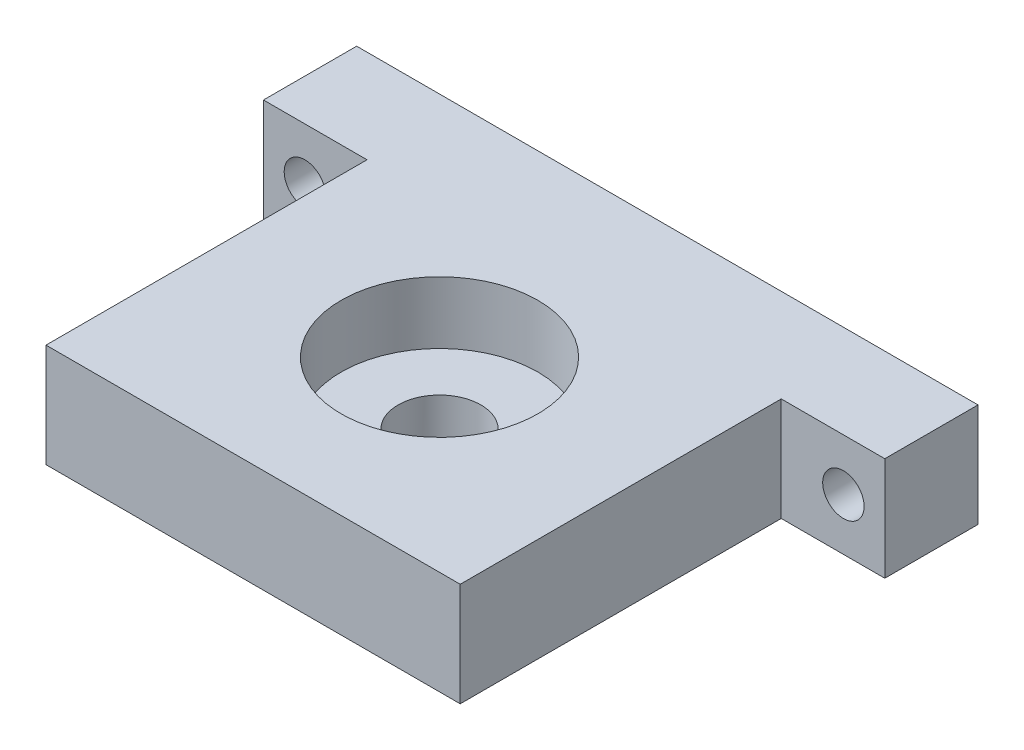
ISO-10303-21;
HEADER;
FILE_DESCRIPTION(('STEP AP214'),'2;1');
FILE_NAME('part.step','',(''),(''),'','','');
FILE_SCHEMA(('AUTOMOTIVE_DESIGN { 1 0 10303 214 1 1 1 1 }'));
ENDSEC;
DATA;
#1=APPLICATION_CONTEXT('core data for automotive mechanical design processes');
#2=APPLICATION_PROTOCOL_DEFINITION('international standard','automotive_design',2000,#1);
#3=PRODUCT_CONTEXT('',#1,'mechanical');
#4=PRODUCT('Part','Part','',(#3));
#5=PRODUCT_RELATED_PRODUCT_CATEGORY('part','',(#4));
#6=PRODUCT_DEFINITION_FORMATION('','',#4);
#7=PRODUCT_DEFINITION_CONTEXT('part definition',#1,'design');
#8=PRODUCT_DEFINITION('design','',#6,#7);
#9=PRODUCT_DEFINITION_SHAPE('','',#8);
#10=(LENGTH_UNIT() NAMED_UNIT(*) SI_UNIT(.MILLI.,.METRE.));
#11=(NAMED_UNIT(*) PLANE_ANGLE_UNIT() SI_UNIT($,.RADIAN.));
#12=(NAMED_UNIT(*) SI_UNIT($,.STERADIAN.) SOLID_ANGLE_UNIT());
#13=UNCERTAINTY_MEASURE_WITH_UNIT(LENGTH_MEASURE(1.E-05),#10,'distance_accuracy_value','');
#14=(GEOMETRIC_REPRESENTATION_CONTEXT(3) GLOBAL_UNCERTAINTY_ASSIGNED_CONTEXT((#13)) GLOBAL_UNIT_ASSIGNED_CONTEXT((#10,
#11,#12)) REPRESENTATION_CONTEXT('',''));
#15=CARTESIAN_POINT('',(0.,0.,0.));
#16=DIRECTION('',(0.,0.,1.));
#17=DIRECTION('',(1.,0.,0.));
#18=AXIS2_PLACEMENT_3D('',#15,#16,#17);
#19=CARTESIAN_POINT('',(-20.,10.,-20.));
#20=DIRECTION('',(0.,0.,1.));
#21=DIRECTION('',(1.,0.,0.));
#22=AXIS2_PLACEMENT_3D('',#19,#20,#21);
#23=PLANE('',#22);
#24=CARTESIAN_POINT('',(26.,5.,-20.));
#25=DIRECTION('',(0.,0.,1.));
#26=DIRECTION('',(1.,0.,0.));
#27=AXIS2_PLACEMENT_3D('',#24,#25,#26);
#28=CIRCLE('',#27,2.);
#29=CARTESIAN_POINT('',(28.,5.,-20.));
#30=VERTEX_POINT('',#29);
#31=EDGE_CURVE('E167',#30,#30,#28,.T.);
#32=ORIENTED_EDGE('',*,*,#31,.T.);
#33=EDGE_LOOP('',(#32));
#34=FACE_BOUND('',#33,.T.);
#35=CARTESIAN_POINT('',(-26.,5.,-20.));
#36=DIRECTION('',(0.,0.,1.));
#37=DIRECTION('',(1.,0.,0.));
#38=AXIS2_PLACEMENT_3D('',#35,#36,#37);
#39=CIRCLE('',#38,2.);
#40=CARTESIAN_POINT('',(-24.,5.,-20.));
#41=VERTEX_POINT('',#40);
#42=EDGE_CURVE('E175',#41,#41,#39,.T.);
#43=ORIENTED_EDGE('',*,*,#42,.T.);
#44=EDGE_LOOP('',(#43));
#45=FACE_BOUND('',#44,.T.);
#46=DIRECTION('',(-1.,0.,0.));
#47=VECTOR('',#46,1.);
#48=CARTESIAN_POINT('',(-20.,0.,-20.));
#49=LINE('',#48,#47);
#50=CARTESIAN_POINT('',(30.,0.,-20.));
#51=VERTEX_POINT('',#50);
#52=CARTESIAN_POINT('',(-30.,0.,-20.));
#53=VERTEX_POINT('',#52);
#54=EDGE_CURVE('E89',#51,#53,#49,.T.);
#55=ORIENTED_EDGE('',*,*,#54,.T.);
#56=DIRECTION('',(0.,-1.,0.));
#57=VECTOR('',#56,1.);
#58=CARTESIAN_POINT('',(-30.,10.,-20.));
#59=LINE('',#58,#57);
#60=CARTESIAN_POINT('',(-30.,10.,-20.));
#61=VERTEX_POINT('',#60);
#62=EDGE_CURVE('E11',#61,#53,#59,.T.);
#63=ORIENTED_EDGE('',*,*,#62,.F.);
#64=DIRECTION('',(-1.,0.,0.));
#65=VECTOR('',#64,1.);
#66=CARTESIAN_POINT('',(20.,10.,-20.));
#67=LINE('',#66,#65);
#68=CARTESIAN_POINT('',(30.,10.,-20.));
#69=VERTEX_POINT('',#68);
#70=EDGE_CURVE('E95',#69,#61,#67,.T.);
#71=ORIENTED_EDGE('',*,*,#70,.F.);
#72=DIRECTION('',(0.,-1.,0.));
#73=VECTOR('',#72,1.);
#74=CARTESIAN_POINT('',(30.,10.,-20.));
#75=LINE('',#74,#73);
#76=EDGE_CURVE('E129',#69,#51,#75,.T.);
#77=ORIENTED_EDGE('',*,*,#76,.T.);
#78=EDGE_LOOP('',(#55,#63,#71,#77));
#79=FACE_BOUND('',#78,.T.);
#80=ADVANCED_FACE('F35',(#34,#45,#79),#23,.F.);
#81=CARTESIAN_POINT('',(-30.,10.,-20.));
#82=DIRECTION('',(1.,0.,0.));
#83=DIRECTION('',(0.,0.,-1.));
#84=AXIS2_PLACEMENT_3D('',#81,#82,#83);
#85=PLANE('',#84);
#86=DIRECTION('',(0.,0.,1.));
#87=VECTOR('',#86,1.);
#88=CARTESIAN_POINT('',(-30.,0.,-20.));
#89=LINE('',#88,#87);
#90=CARTESIAN_POINT('',(-30.,0.,-11.));
#91=VERTEX_POINT('',#90);
#92=EDGE_CURVE('E134',#53,#91,#89,.T.);
#93=ORIENTED_EDGE('',*,*,#92,.T.);
#94=DIRECTION('',(0.,-1.,0.));
#95=VECTOR('',#94,1.);
#96=CARTESIAN_POINT('',(-30.,10.,-11.));
#97=LINE('',#96,#95);
#98=CARTESIAN_POINT('',(-30.,10.,-11.));
#99=VERTEX_POINT('',#98);
#100=EDGE_CURVE('E44',#99,#91,#97,.T.);
#101=ORIENTED_EDGE('',*,*,#100,.F.);
#102=DIRECTION('',(0.,0.,1.));
#103=VECTOR('',#102,1.);
#104=CARTESIAN_POINT('',(-30.,10.,-20.));
#105=LINE('',#104,#103);
#106=EDGE_CURVE('E184',#61,#99,#105,.T.);
#107=ORIENTED_EDGE('',*,*,#106,.F.);
#108=ORIENTED_EDGE('',*,*,#62,.T.);
#109=EDGE_LOOP('',(#93,#101,#107,#108));
#110=FACE_BOUND('',#109,.T.);
#111=ADVANCED_FACE('F206',(#110),#85,.F.);
#112=CARTESIAN_POINT('',(-20.,10.,-11.));
#113=DIRECTION('',(0.,0.,-1.));
#114=DIRECTION('',(-1.,0.,0.));
#115=AXIS2_PLACEMENT_3D('',#112,#113,#114);
#116=PLANE('',#115);
#117=CARTESIAN_POINT('',(-26.,5.,-11.));
#118=DIRECTION('',(0.,0.,-1.));
#119=DIRECTION('',(-1.,0.,0.));
#120=AXIS2_PLACEMENT_3D('',#117,#118,#119);
#121=CIRCLE('',#120,2.);
#122=CARTESIAN_POINT('',(-28.,5.,-11.));
#123=VERTEX_POINT('',#122);
#124=EDGE_CURVE('E38',#123,#123,#121,.T.);
#125=ORIENTED_EDGE('',*,*,#124,.T.);
#126=EDGE_LOOP('',(#125));
#127=FACE_BOUND('',#126,.T.);
#128=DIRECTION('',(1.,0.,0.));
#129=VECTOR('',#128,1.);
#130=CARTESIAN_POINT('',(-20.,0.,-11.));
#131=LINE('',#130,#129);
#132=CARTESIAN_POINT('',(-20.,0.,-11.));
#133=VERTEX_POINT('',#132);
#134=EDGE_CURVE('E137',#91,#133,#131,.T.);
#135=ORIENTED_EDGE('',*,*,#134,.T.);
#136=DIRECTION('',(0.,-1.,0.));
#137=VECTOR('',#136,1.);
#138=CARTESIAN_POINT('',(-20.,10.,-11.));
#139=LINE('',#138,#137);
#140=CARTESIAN_POINT('',(-20.,10.,-11.));
#141=VERTEX_POINT('',#140);
#142=EDGE_CURVE('E154',#141,#133,#139,.T.);
#143=ORIENTED_EDGE('',*,*,#142,.F.);
#144=DIRECTION('',(1.,0.,0.));
#145=VECTOR('',#144,1.);
#146=CARTESIAN_POINT('',(-20.,10.,-11.));
#147=LINE('',#146,#145);
#148=EDGE_CURVE('E186',#99,#141,#147,.T.);
#149=ORIENTED_EDGE('',*,*,#148,.F.);
#150=ORIENTED_EDGE('',*,*,#100,.T.);
#151=EDGE_LOOP('',(#135,#143,#149,#150));
#152=FACE_BOUND('',#151,.T.);
#153=ADVANCED_FACE('F209',(#127,#152),#116,.F.);
#154=CARTESIAN_POINT('',(-20.,10.,20.));
#155=DIRECTION('',(1.,0.,0.));
#156=DIRECTION('',(0.,0.,-1.));
#157=AXIS2_PLACEMENT_3D('',#154,#155,#156);
#158=PLANE('',#157);
#159=DIRECTION('',(0.,0.,1.));
#160=VECTOR('',#159,1.);
#161=CARTESIAN_POINT('',(-20.,0.,20.));
#162=LINE('',#161,#160);
#163=CARTESIAN_POINT('',(-20.,0.,20.));
#164=VERTEX_POINT('',#163);
#165=EDGE_CURVE('E139',#133,#164,#162,.T.);
#166=ORIENTED_EDGE('',*,*,#165,.T.);
#167=DIRECTION('',(0.,-1.,0.));
#168=VECTOR('',#167,1.);
#169=CARTESIAN_POINT('',(-20.,10.,20.));
#170=LINE('',#169,#168);
#171=CARTESIAN_POINT('',(-20.,10.,20.));
#172=VERTEX_POINT('',#171);
#173=EDGE_CURVE('E151',#172,#164,#170,.T.);
#174=ORIENTED_EDGE('',*,*,#173,.F.);
#175=DIRECTION('',(0.,0.,1.));
#176=VECTOR('',#175,1.);
#177=CARTESIAN_POINT('',(-20.,10.,20.));
#178=LINE('',#177,#176);
#179=EDGE_CURVE('E188',#141,#172,#178,.T.);
#180=ORIENTED_EDGE('',*,*,#179,.F.);
#181=ORIENTED_EDGE('',*,*,#142,.T.);
#182=EDGE_LOOP('',(#166,#174,#180,#181));
#183=FACE_BOUND('',#182,.T.);
#184=ADVANCED_FACE('F194',(#183),#158,.F.);
#185=CARTESIAN_POINT('',(-20.,10.,20.));
#186=DIRECTION('',(0.,0.,-1.));
#187=DIRECTION('',(-1.,0.,0.));
#188=AXIS2_PLACEMENT_3D('',#185,#186,#187);
#189=PLANE('',#188);
#190=DIRECTION('',(1.,0.,0.));
#191=VECTOR('',#190,1.);
#192=CARTESIAN_POINT('',(-20.,0.,20.));
#193=LINE('',#192,#191);
#194=CARTESIAN_POINT('',(20.,0.,20.));
#195=VERTEX_POINT('',#194);
#196=EDGE_CURVE('E141',#164,#195,#193,.T.);
#197=ORIENTED_EDGE('',*,*,#196,.T.);
#198=DIRECTION('',(0.,-1.,0.));
#199=VECTOR('',#198,1.);
#200=CARTESIAN_POINT('',(20.,10.,20.));
#201=LINE('',#200,#199);
#202=CARTESIAN_POINT('',(20.,10.,20.));
#203=VERTEX_POINT('',#202);
#204=EDGE_CURVE('E124',#203,#195,#201,.T.);
#205=ORIENTED_EDGE('',*,*,#204,.F.);
#206=DIRECTION('',(1.,0.,0.));
#207=VECTOR('',#206,1.);
#208=CARTESIAN_POINT('',(-20.,10.,20.));
#209=LINE('',#208,#207);
#210=EDGE_CURVE('E115',#172,#203,#209,.T.);
#211=ORIENTED_EDGE('',*,*,#210,.F.);
#212=ORIENTED_EDGE('',*,*,#173,.T.);
#213=EDGE_LOOP('',(#197,#205,#211,#212));
#214=FACE_BOUND('',#213,.T.);
#215=ADVANCED_FACE('F198',(#214),#189,.F.);
#216=CARTESIAN_POINT('',(20.,10.,20.));
#217=DIRECTION('',(-1.,0.,0.));
#218=DIRECTION('',(0.,0.,1.));
#219=AXIS2_PLACEMENT_3D('',#216,#217,#218);
#220=PLANE('',#219);
#221=DIRECTION('',(0.,0.,-1.));
#222=VECTOR('',#221,1.);
#223=CARTESIAN_POINT('',(20.,0.,20.));
#224=LINE('',#223,#222);
#225=CARTESIAN_POINT('',(20.,0.,-11.));
#226=VERTEX_POINT('',#225);
#227=EDGE_CURVE('E123',#195,#226,#224,.T.);
#228=ORIENTED_EDGE('',*,*,#227,.T.);
#229=DIRECTION('',(0.,-1.,0.));
#230=VECTOR('',#229,1.);
#231=CARTESIAN_POINT('',(20.,10.,-11.));
#232=LINE('',#231,#230);
#233=CARTESIAN_POINT('',(20.,10.,-11.));
#234=VERTEX_POINT('',#233);
#235=EDGE_CURVE('E120',#234,#226,#232,.T.);
#236=ORIENTED_EDGE('',*,*,#235,.F.);
#237=DIRECTION('',(0.,0.,-1.));
#238=VECTOR('',#237,1.);
#239=CARTESIAN_POINT('',(20.,10.,20.));
#240=LINE('',#239,#238);
#241=EDGE_CURVE('E109',#203,#234,#240,.T.);
#242=ORIENTED_EDGE('',*,*,#241,.F.);
#243=ORIENTED_EDGE('',*,*,#204,.T.);
#244=EDGE_LOOP('',(#228,#236,#242,#243));
#245=FACE_BOUND('',#244,.T.);
#246=ADVANCED_FACE('F121',(#245),#220,.F.);
#247=CARTESIAN_POINT('',(20.,10.,-11.));
#248=DIRECTION('',(0.,0.,-1.));
#249=DIRECTION('',(-1.,0.,0.));
#250=AXIS2_PLACEMENT_3D('',#247,#248,#249);
#251=PLANE('',#250);
#252=CARTESIAN_POINT('',(26.,5.,-11.));
#253=DIRECTION('',(0.,0.,-1.));
#254=DIRECTION('',(-1.,0.,0.));
#255=AXIS2_PLACEMENT_3D('',#252,#253,#254);
#256=CIRCLE('',#255,2.);
#257=CARTESIAN_POINT('',(24.,5.,-11.));
#258=VERTEX_POINT('',#257);
#259=EDGE_CURVE('E165',#258,#258,#256,.T.);
#260=ORIENTED_EDGE('',*,*,#259,.T.);
#261=EDGE_LOOP('',(#260));
#262=FACE_BOUND('',#261,.T.);
#263=DIRECTION('',(1.,0.,0.));
#264=VECTOR('',#263,1.);
#265=CARTESIAN_POINT('',(20.,0.,-11.));
#266=LINE('',#265,#264);
#267=CARTESIAN_POINT('',(30.,0.,-11.));
#268=VERTEX_POINT('',#267);
#269=EDGE_CURVE('E82',#226,#268,#266,.T.);
#270=ORIENTED_EDGE('',*,*,#269,.T.);
#271=DIRECTION('',(0.,-1.,0.));
#272=VECTOR('',#271,1.);
#273=CARTESIAN_POINT('',(30.,10.,-11.));
#274=LINE('',#273,#272);
#275=CARTESIAN_POINT('',(30.,10.,-11.));
#276=VERTEX_POINT('',#275);
#277=EDGE_CURVE('E125',#276,#268,#274,.T.);
#278=ORIENTED_EDGE('',*,*,#277,.F.);
#279=DIRECTION('',(1.,0.,0.));
#280=VECTOR('',#279,1.);
#281=CARTESIAN_POINT('',(20.,10.,-11.));
#282=LINE('',#281,#280);
#283=EDGE_CURVE('E113',#234,#276,#282,.T.);
#284=ORIENTED_EDGE('',*,*,#283,.F.);
#285=ORIENTED_EDGE('',*,*,#235,.T.);
#286=EDGE_LOOP('',(#270,#278,#284,#285));
#287=FACE_BOUND('',#286,.T.);
#288=ADVANCED_FACE('F127',(#262,#287),#251,.F.);
#289=CARTESIAN_POINT('',(30.,10.,-20.));
#290=DIRECTION('',(-1.,0.,0.));
#291=DIRECTION('',(0.,0.,1.));
#292=AXIS2_PLACEMENT_3D('',#289,#290,#291);
#293=PLANE('',#292);
#294=DIRECTION('',(0.,0.,-1.));
#295=VECTOR('',#294,1.);
#296=CARTESIAN_POINT('',(30.,0.,-20.));
#297=LINE('',#296,#295);
#298=EDGE_CURVE('E145',#268,#51,#297,.T.);
#299=ORIENTED_EDGE('',*,*,#298,.T.);
#300=ORIENTED_EDGE('',*,*,#76,.F.);
#301=DIRECTION('',(0.,0.,-1.));
#302=VECTOR('',#301,1.);
#303=CARTESIAN_POINT('',(30.,10.,-20.));
#304=LINE('',#303,#302);
#305=EDGE_CURVE('E53',#276,#69,#304,.T.);
#306=ORIENTED_EDGE('',*,*,#305,.F.);
#307=ORIENTED_EDGE('',*,*,#277,.T.);
#308=EDGE_LOOP('',(#299,#300,#306,#307));
#309=FACE_BOUND('',#308,.T.);
#310=ADVANCED_FACE('F201',(#309),#293,.F.);
#311=CARTESIAN_POINT('',(0.,10.,0.));
#312=DIRECTION('',(0.,-1.,0.));
#313=DIRECTION('',(0.,0.,-1.));
#314=AXIS2_PLACEMENT_3D('',#311,#312,#313);
#315=PLANE('',#314);
#316=CARTESIAN_POINT('',(0.,10.,2.));
#317=DIRECTION('',(0.,-1.,0.));
#318=DIRECTION('',(0.,0.,-1.));
#319=AXIS2_PLACEMENT_3D('',#316,#317,#318);
#320=CIRCLE('',#319,9.5);
#321=CARTESIAN_POINT('',(0.,10.,-7.5));
#322=VERTEX_POINT('',#321);
#323=EDGE_CURVE('E135',#322,#322,#320,.F.);
#324=ORIENTED_EDGE('',*,*,#323,.F.);
#325=EDGE_LOOP('',(#324));
#326=FACE_BOUND('',#325,.T.);
#327=ORIENTED_EDGE('',*,*,#70,.T.);
#328=ORIENTED_EDGE('',*,*,#106,.T.);
#329=ORIENTED_EDGE('',*,*,#148,.T.);
#330=ORIENTED_EDGE('',*,*,#179,.T.);
#331=ORIENTED_EDGE('',*,*,#210,.T.);
#332=ORIENTED_EDGE('',*,*,#241,.T.);
#333=ORIENTED_EDGE('',*,*,#283,.T.);
#334=ORIENTED_EDGE('',*,*,#305,.T.);
#335=EDGE_LOOP('',(#327,#328,#329,#330,#331,#332,#333,#334));
#336=FACE_BOUND('',#335,.T.);
#337=ADVANCED_FACE('F111',(#326,#336),#315,.F.);
#338=CARTESIAN_POINT('',(0.,0.,0.));
#339=DIRECTION('',(0.,-1.,0.));
#340=DIRECTION('',(0.,0.,-1.));
#341=AXIS2_PLACEMENT_3D('',#338,#339,#340);
#342=PLANE('',#341);
#343=CARTESIAN_POINT('',(0.,0.,2.));
#344=DIRECTION('',(0.,-1.,0.));
#345=DIRECTION('',(0.,0.,-1.));
#346=AXIS2_PLACEMENT_3D('',#343,#344,#345);
#347=CIRCLE('',#346,4.);
#348=CARTESIAN_POINT('',(0.,0.,-2.));
#349=VERTEX_POINT('',#348);
#350=EDGE_CURVE('E162',#349,#349,#347,.T.);
#351=ORIENTED_EDGE('',*,*,#350,.F.);
#352=EDGE_LOOP('',(#351));
#353=FACE_BOUND('',#352,.T.);
#354=ORIENTED_EDGE('',*,*,#54,.F.);
#355=ORIENTED_EDGE('',*,*,#298,.F.);
#356=ORIENTED_EDGE('',*,*,#269,.F.);
#357=ORIENTED_EDGE('',*,*,#227,.F.);
#358=ORIENTED_EDGE('',*,*,#196,.F.);
#359=ORIENTED_EDGE('',*,*,#165,.F.);
#360=ORIENTED_EDGE('',*,*,#134,.F.);
#361=ORIENTED_EDGE('',*,*,#92,.F.);
#362=EDGE_LOOP('',(#354,#355,#356,#357,#358,#359,#360,#361));
#363=FACE_BOUND('',#362,.T.);
#364=ADVANCED_FACE('F199',(#353,#363),#342,.T.);
#365=CARTESIAN_POINT('',(0.,10.000012,2.));
#366=DIRECTION('',(0.,-1.,0.));
#367=DIRECTION('',(0.,0.,-1.));
#368=AXIS2_PLACEMENT_3D('',#365,#366,#367);
#369=CYLINDRICAL_SURFACE('',#368,9.5);
#370=CARTESIAN_POINT('',(0.,4.,2.));
#371=DIRECTION('',(0.,1.,0.));
#372=DIRECTION('',(0.,0.,1.));
#373=AXIS2_PLACEMENT_3D('',#370,#371,#372);
#374=CIRCLE('',#373,9.5);
#375=CARTESIAN_POINT('',(0.,4.,-7.5));
#376=VERTEX_POINT('',#375);
#377=EDGE_CURVE('E161',#376,#376,#374,.T.);
#378=CARTESIAN_POINT('',(0.,4.,-7.5));
#379=CARTESIAN_POINT('',(0.,4.0625,-7.5));
#380=CARTESIAN_POINT('',(0.,4.125,-7.5));
#381=CARTESIAN_POINT('',(0.,4.25,-7.5));
#382=CARTESIAN_POINT('',(0.,4.3125,-7.5));
#383=CARTESIAN_POINT('',(0.,4.4375,-7.5));
#384=CARTESIAN_POINT('',(0.,4.5,-7.5));
#385=CARTESIAN_POINT('',(0.,4.625,-7.5));
#386=CARTESIAN_POINT('',(0.,4.6875,-7.5));
#387=CARTESIAN_POINT('',(0.,4.8125,-7.5));
#388=CARTESIAN_POINT('',(0.,4.875,-7.5));
#389=CARTESIAN_POINT('',(0.,5.,-7.5));
#390=CARTESIAN_POINT('',(0.,5.0625,-7.5));
#391=CARTESIAN_POINT('',(0.,5.1875,-7.5));
#392=CARTESIAN_POINT('',(0.,5.25,-7.5));
#393=CARTESIAN_POINT('',(0.,5.375,-7.5));
#394=CARTESIAN_POINT('',(0.,5.4375,-7.5));
#395=CARTESIAN_POINT('',(0.,5.5625,-7.5));
#396=CARTESIAN_POINT('',(0.,5.625,-7.5));
#397=CARTESIAN_POINT('',(0.,5.75,-7.5));
#398=CARTESIAN_POINT('',(0.,5.8125,-7.5));
#399=CARTESIAN_POINT('',(0.,5.9375,-7.5));
#400=CARTESIAN_POINT('',(0.,6.,-7.5));
#401=CARTESIAN_POINT('',(0.,6.125,-7.5));
#402=CARTESIAN_POINT('',(0.,6.1875,-7.5));
#403=CARTESIAN_POINT('',(0.,6.3125,-7.5));
#404=CARTESIAN_POINT('',(0.,6.375,-7.5));
#405=CARTESIAN_POINT('',(0.,6.5,-7.5));
#406=CARTESIAN_POINT('',(0.,6.5625,-7.5));
#407=CARTESIAN_POINT('',(0.,6.6875,-7.5));
#408=CARTESIAN_POINT('',(0.,6.75,-7.5));
#409=CARTESIAN_POINT('',(0.,6.875,-7.5));
#410=CARTESIAN_POINT('',(0.,6.9375,-7.5));
#411=CARTESIAN_POINT('',(0.,7.0625,-7.5));
#412=CARTESIAN_POINT('',(0.,7.125,-7.5));
#413=CARTESIAN_POINT('',(0.,7.25,-7.5));
#414=CARTESIAN_POINT('',(0.,7.3125,-7.5));
#415=CARTESIAN_POINT('',(0.,7.4375,-7.5));
#416=CARTESIAN_POINT('',(0.,7.5,-7.5));
#417=CARTESIAN_POINT('',(0.,7.625,-7.5));
#418=CARTESIAN_POINT('',(0.,7.6875,-7.5));
#419=CARTESIAN_POINT('',(0.,7.8125,-7.5));
#420=CARTESIAN_POINT('',(0.,7.875,-7.5));
#421=CARTESIAN_POINT('',(0.,8.,-7.5));
#422=CARTESIAN_POINT('',(0.,8.0625,-7.5));
#423=CARTESIAN_POINT('',(0.,8.1875,-7.5));
#424=CARTESIAN_POINT('',(0.,8.25,-7.5));
#425=CARTESIAN_POINT('',(0.,8.375,-7.5));
#426=CARTESIAN_POINT('',(0.,8.4375,-7.5));
#427=CARTESIAN_POINT('',(0.,8.5625,-7.5));
#428=CARTESIAN_POINT('',(0.,8.625,-7.5));
#429=CARTESIAN_POINT('',(0.,8.75,-7.5));
#430=CARTESIAN_POINT('',(0.,8.8125,-7.5));
#431=CARTESIAN_POINT('',(0.,8.9375,-7.5));
#432=CARTESIAN_POINT('',(0.,9.,-7.5));
#433=CARTESIAN_POINT('',(0.,9.125,-7.5));
#434=CARTESIAN_POINT('',(0.,9.1875,-7.5));
#435=CARTESIAN_POINT('',(0.,9.3125,-7.5));
#436=CARTESIAN_POINT('',(0.,9.375,-7.5));
#437=CARTESIAN_POINT('',(0.,9.5,-7.5));
#438=CARTESIAN_POINT('',(0.,9.5625,-7.5));
#439=CARTESIAN_POINT('',(0.,9.6875,-7.5));
#440=CARTESIAN_POINT('',(0.,9.75,-7.5));
#441=CARTESIAN_POINT('',(0.,9.875,-7.5));
#442=CARTESIAN_POINT('',(0.,9.9375,-7.5));
#443=CARTESIAN_POINT('',(0.,10.,-7.5));
#444=B_SPLINE_CURVE_WITH_KNOTS('',3,(#378,#379,#380,#381,#382,#383,#384,#385,#386,#387,#388,
#389,#390,#391,#392,#393,#394,#395,#396,#397,#398,#399,#400,#401,#402,#403,#404,#405,#406,#407,
#408,#409,#410,#411,#412,#413,#414,#415,#416,#417,#418,#419,#420,#421,#422,#423,#424,#425,#426,
#427,#428,#429,#430,#431,#432,#433,#434,#435,#436,#437,#438,#439,#440,#441,#442,#443),
.UNSPECIFIED.,.F.,.F.,(4,2,2,2,2,2,2,2,2,2,2,2,2,2,2,2,2,2,2,2,2,2,2,2,2,2,2,2,2,2,2,2,4),(0.,
0.1875,0.375,0.5625,0.750000000000001,0.937500000000001,1.125,1.3125,1.5,1.6875,1.875,2.0625,
2.25,2.4375,2.625,2.8125,3.,3.1875,3.375,3.5625,3.75,3.9375,4.125,4.3125,4.5,4.6875,4.875,
5.0625,5.25,5.4375,5.625,5.8125,6.),.UNSPECIFIED.);
#445=EDGE_CURVE('BSEAM245',#376,#322,#444,.T.);
#446=ORIENTED_EDGE('',*,*,#377,.F.);
#447=ORIENTED_EDGE('',*,*,#323,.T.);
#448=ORIENTED_EDGE('',*,*,#445,.T.);
#449=ORIENTED_EDGE('',*,*,#445,.F.);
#450=EDGE_LOOP('',(#446,#448,#447,#449));
#451=FACE_BOUND('',#450,.T.);
#452=ADVANCED_FACE('F245',(#451),#369,.F.);
#453=CARTESIAN_POINT('',(0.,4.,2.));
#454=DIRECTION('',(0.,1.,0.));
#455=DIRECTION('',(0.,0.,1.));
#456=AXIS2_PLACEMENT_3D('',#453,#454,#455);
#457=PLANE('',#456);
#458=CARTESIAN_POINT('',(0.,4.,2.));
#459=DIRECTION('',(0.,1.,0.));
#460=DIRECTION('',(0.,0.,1.));
#461=AXIS2_PLACEMENT_3D('',#458,#459,#460);
#462=CIRCLE('',#461,4.);
#463=CARTESIAN_POINT('',(0.,4.,6.));
#464=VERTEX_POINT('',#463);
#465=EDGE_CURVE('E164',#464,#464,#462,.T.);
#466=ORIENTED_EDGE('',*,*,#465,.F.);
#467=EDGE_LOOP('',(#466));
#468=FACE_BOUND('',#467,.T.);
#469=ORIENTED_EDGE('',*,*,#377,.T.);
#470=EDGE_LOOP('',(#469));
#471=FACE_BOUND('',#470,.T.);
#472=ADVANCED_FACE('F241',(#468,#471),#457,.T.);
#473=CARTESIAN_POINT('',(0.,-6.,2.));
#474=DIRECTION('',(0.,1.,0.));
#475=DIRECTION('',(0.,0.,1.));
#476=AXIS2_PLACEMENT_3D('',#473,#474,#475);
#477=CYLINDRICAL_SURFACE('',#476,4.);
#478=ORIENTED_EDGE('',*,*,#350,.T.);
#479=EDGE_LOOP('',(#478));
#480=FACE_BOUND('',#479,.T.);
#481=ORIENTED_EDGE('',*,*,#465,.T.);
#482=EDGE_LOOP('',(#481));
#483=FACE_BOUND('',#482,.T.);
#484=ADVANCED_FACE('F234',(#480,#483),#477,.F.);
#485=CARTESIAN_POINT('',(26.,5.,20.));
#486=DIRECTION('',(0.,0.,-1.));
#487=DIRECTION('',(-1.,0.,0.));
#488=AXIS2_PLACEMENT_3D('',#485,#486,#487);
#489=CYLINDRICAL_SURFACE('',#488,2.);
#490=ORIENTED_EDGE('',*,*,#259,.F.);
#491=EDGE_LOOP('',(#490));
#492=FACE_BOUND('',#491,.T.);
#493=ORIENTED_EDGE('',*,*,#31,.F.);
#494=EDGE_LOOP('',(#493));
#495=FACE_BOUND('',#494,.T.);
#496=ADVANCED_FACE('F228',(#492,#495),#489,.F.);
#497=CARTESIAN_POINT('',(-26.,5.,20.));
#498=DIRECTION('',(0.,0.,-1.));
#499=DIRECTION('',(-1.,0.,0.));
#500=AXIS2_PLACEMENT_3D('',#497,#498,#499);
#501=CYLINDRICAL_SURFACE('',#500,2.);
#502=ORIENTED_EDGE('',*,*,#124,.F.);
#503=EDGE_LOOP('',(#502));
#504=FACE_BOUND('',#503,.T.);
#505=ORIENTED_EDGE('',*,*,#42,.F.);
#506=EDGE_LOOP('',(#505));
#507=FACE_BOUND('',#506,.T.);
#508=ADVANCED_FACE('F226',(#504,#507),#501,.F.);
#509=CLOSED_SHELL('',(#80,#111,#153,#184,#215,#246,#288,#310,#337,#364,#452,#472,#484,#496,#508));
#510=MANIFOLD_SOLID_BREP('B2',#509);
#511=ADVANCED_BREP_SHAPE_REPRESENTATION('',(#18,#510),#14);
#512=SHAPE_DEFINITION_REPRESENTATION(#9,#511);
ENDSEC;
END-ISO-10303-21;
